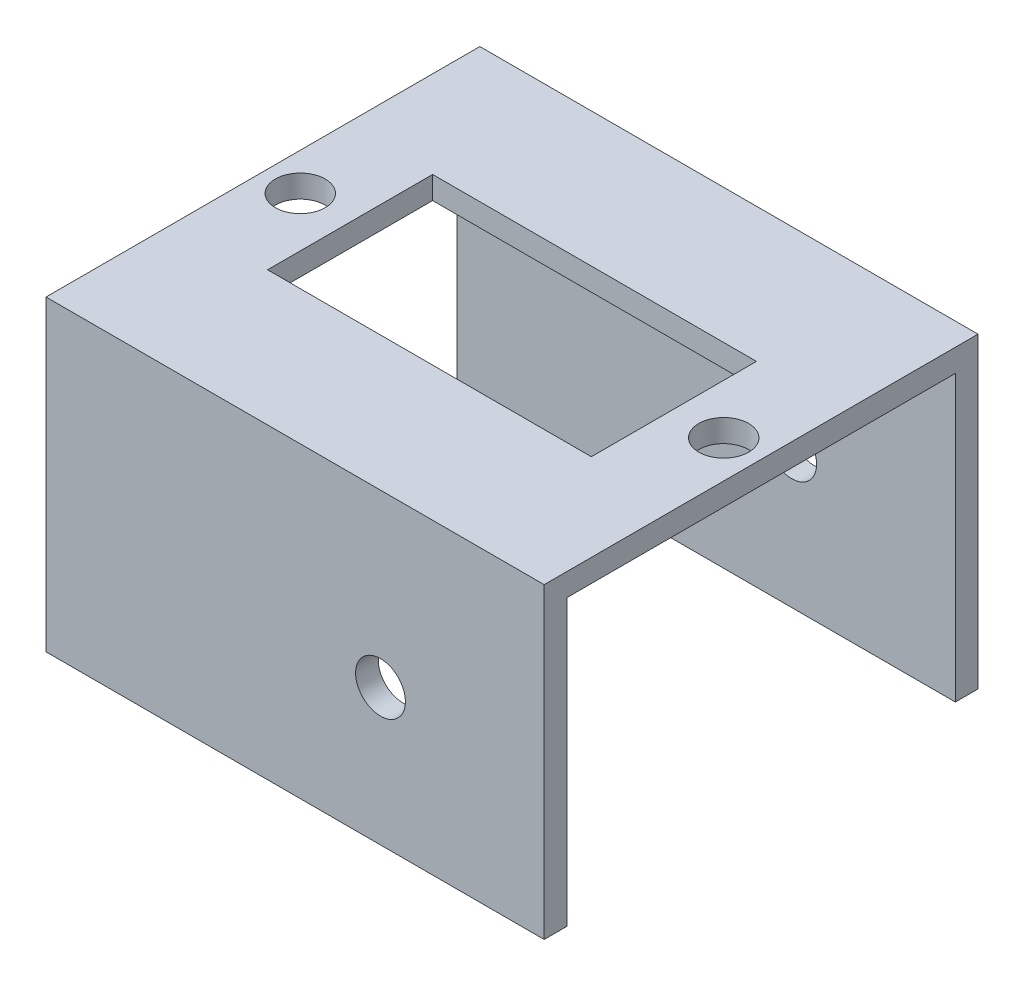
ISO-10303-21;
HEADER;
FILE_DESCRIPTION(('STEP AP214'),'2;1');
FILE_NAME('part.step','',(''),(''),'','','');
FILE_SCHEMA(('AUTOMOTIVE_DESIGN { 1 0 10303 214 1 1 1 1 }'));
ENDSEC;
DATA;
#1=APPLICATION_CONTEXT('core data for automotive mechanical design processes');
#2=APPLICATION_PROTOCOL_DEFINITION('international standard','automotive_design',2000,#1);
#3=PRODUCT_CONTEXT('',#1,'mechanical');
#4=PRODUCT('Part','Part','',(#3));
#5=PRODUCT_RELATED_PRODUCT_CATEGORY('part','',(#4));
#6=PRODUCT_DEFINITION_FORMATION('','',#4);
#7=PRODUCT_DEFINITION_CONTEXT('part definition',#1,'design');
#8=PRODUCT_DEFINITION('design','',#6,#7);
#9=PRODUCT_DEFINITION_SHAPE('','',#8);
#10=(LENGTH_UNIT() NAMED_UNIT(*) SI_UNIT(.MILLI.,.METRE.));
#11=(NAMED_UNIT(*) PLANE_ANGLE_UNIT() SI_UNIT($,.RADIAN.));
#12=(NAMED_UNIT(*) SI_UNIT($,.STERADIAN.) SOLID_ANGLE_UNIT());
#13=UNCERTAINTY_MEASURE_WITH_UNIT(LENGTH_MEASURE(1.E-05),#10,'distance_accuracy_value','');
#14=(GEOMETRIC_REPRESENTATION_CONTEXT(3) GLOBAL_UNCERTAINTY_ASSIGNED_CONTEXT((#13)) GLOBAL_UNIT_ASSIGNED_CONTEXT((#10,
#11,#12)) REPRESENTATION_CONTEXT('',''));
#15=CARTESIAN_POINT('',(0.,0.,0.));
#16=DIRECTION('',(0.,0.,1.));
#17=DIRECTION('',(1.,0.,0.));
#18=AXIS2_PLACEMENT_3D('',#15,#16,#17);
#19=CARTESIAN_POINT('',(0.,0.,0.));
#20=DIRECTION('',(0.,1.,0.));
#21=DIRECTION('',(0.,0.,1.));
#22=AXIS2_PLACEMENT_3D('',#19,#20,#21);
#23=PLANE('',#22);
#24=DIRECTION('',(0.,0.,-1.));
#25=VECTOR('',#24,1.);
#26=CARTESIAN_POINT('',(11.375,0.,-5.8));
#27=LINE('',#26,#25);
#28=CARTESIAN_POINT('',(11.375,0.,5.8));
#29=VERTEX_POINT('',#28);
#30=CARTESIAN_POINT('',(11.375,0.,-5.8));
#31=VERTEX_POINT('',#30);
#32=EDGE_CURVE('E187',#29,#31,#27,.T.);
#33=ORIENTED_EDGE('',*,*,#32,.T.);
#34=DIRECTION('',(-1.,0.,0.));
#35=VECTOR('',#34,1.);
#36=CARTESIAN_POINT('',(-11.375,0.,-5.8));
#37=LINE('',#36,#35);
#38=CARTESIAN_POINT('',(-11.375,0.,-5.8));
#39=VERTEX_POINT('',#38);
#40=EDGE_CURVE('E203',#31,#39,#37,.T.);
#41=ORIENTED_EDGE('',*,*,#40,.T.);
#42=DIRECTION('',(0.,0.,1.));
#43=VECTOR('',#42,1.);
#44=CARTESIAN_POINT('',(-11.375,0.,-5.8));
#45=LINE('',#44,#43);
#46=CARTESIAN_POINT('',(-11.375,0.,5.8));
#47=VERTEX_POINT('',#46);
#48=EDGE_CURVE('E206',#39,#47,#45,.T.);
#49=ORIENTED_EDGE('',*,*,#48,.T.);
#50=DIRECTION('',(1.,0.,0.));
#51=VECTOR('',#50,1.);
#52=CARTESIAN_POINT('',(-11.375,0.,5.8));
#53=LINE('',#52,#51);
#54=EDGE_CURVE('E193',#47,#29,#53,.T.);
#55=ORIENTED_EDGE('',*,*,#54,.T.);
#56=EDGE_LOOP('',(#33,#41,#49,#55));
#57=FACE_BOUND('',#56,.T.);
#58=CARTESIAN_POINT('',(-14.875,0.,0.));
#59=DIRECTION('',(0.,1.,0.));
#60=DIRECTION('',(0.,0.,1.));
#61=AXIS2_PLACEMENT_3D('',#58,#59,#60);
#62=CIRCLE('',#61,1.75);
#63=CARTESIAN_POINT('',(-14.875,0.,-1.75));
#64=VERTEX_POINT('',#63);
#65=EDGE_CURVE('E181',#64,#64,#62,.T.);
#66=ORIENTED_EDGE('',*,*,#65,.T.);
#67=EDGE_LOOP('',(#66));
#68=FACE_BOUND('',#67,.T.);
#69=CARTESIAN_POINT('',(14.875,0.,0.));
#70=DIRECTION('',(0.,1.,0.));
#71=DIRECTION('',(0.,0.,1.));
#72=AXIS2_PLACEMENT_3D('',#69,#70,#71);
#73=CIRCLE('',#72,1.75);
#74=CARTESIAN_POINT('',(14.875,0.,-1.75));
#75=VERTEX_POINT('',#74);
#76=EDGE_CURVE('E175',#75,#75,#73,.T.);
#77=ORIENTED_EDGE('',*,*,#76,.T.);
#78=EDGE_LOOP('',(#77));
#79=FACE_BOUND('',#78,.T.);
#80=DIRECTION('',(-1.,0.,0.));
#81=VECTOR('',#80,1.);
#82=CARTESIAN_POINT('',(-22.5,0.,-13.65));
#83=LINE('',#82,#81);
#84=CARTESIAN_POINT('',(17.5,0.,-13.65));
#85=VERTEX_POINT('',#84);
#86=CARTESIAN_POINT('',(-17.5,0.,-13.65));
#87=VERTEX_POINT('',#86);
#88=EDGE_CURVE('E161',#85,#87,#83,.T.);
#89=ORIENTED_EDGE('',*,*,#88,.F.);
#90=DIRECTION('',(0.,0.,1.));
#91=VECTOR('',#90,1.);
#92=CARTESIAN_POINT('',(17.5,0.,0.));
#93=LINE('',#92,#91);
#94=CARTESIAN_POINT('',(17.5,0.,13.65));
#95=VERTEX_POINT('',#94);
#96=EDGE_CURVE('E254',#85,#95,#93,.T.);
#97=ORIENTED_EDGE('',*,*,#96,.T.);
#98=DIRECTION('',(1.,0.,0.));
#99=VECTOR('',#98,1.);
#100=CARTESIAN_POINT('',(-22.5,0.,13.65));
#101=LINE('',#100,#99);
#102=CARTESIAN_POINT('',(-17.5,0.,13.65));
#103=VERTEX_POINT('',#102);
#104=EDGE_CURVE('E163',#103,#95,#101,.T.);
#105=ORIENTED_EDGE('',*,*,#104,.F.);
#106=DIRECTION('',(0.,0.,-1.));
#107=VECTOR('',#106,1.);
#108=CARTESIAN_POINT('',(-17.5,0.,0.));
#109=LINE('',#108,#107);
#110=EDGE_CURVE('E255',#103,#87,#109,.T.);
#111=ORIENTED_EDGE('',*,*,#110,.T.);
#112=EDGE_LOOP('',(#89,#97,#105,#111));
#113=FACE_BOUND('',#112,.T.);
#114=ADVANCED_FACE('F34',(#57,#68,#79,#113),#23,.F.);
#115=CARTESIAN_POINT('',(0.,1.59,0.));
#116=DIRECTION('',(0.,1.,0.));
#117=DIRECTION('',(0.,0.,1.));
#118=AXIS2_PLACEMENT_3D('',#115,#116,#117);
#119=PLANE('',#118);
#120=DIRECTION('',(0.,0.,1.));
#121=VECTOR('',#120,1.);
#122=CARTESIAN_POINT('',(17.5,1.59,-15.24));
#123=LINE('',#122,#121);
#124=CARTESIAN_POINT('',(17.5,1.59,-15.24));
#125=VERTEX_POINT('',#124);
#126=CARTESIAN_POINT('',(17.5,1.59,15.24));
#127=VERTEX_POINT('',#126);
#128=EDGE_CURVE('E125',#125,#127,#123,.T.);
#129=ORIENTED_EDGE('',*,*,#128,.F.);
#130=DIRECTION('',(-1.,0.,0.));
#131=VECTOR('',#130,1.);
#132=CARTESIAN_POINT('',(-22.5,1.59,-15.24));
#133=LINE('',#132,#131);
#134=CARTESIAN_POINT('',(-17.5,1.59,-15.24));
#135=VERTEX_POINT('',#134);
#136=EDGE_CURVE('E138',#125,#135,#133,.T.);
#137=ORIENTED_EDGE('',*,*,#136,.T.);
#138=DIRECTION('',(0.,0.,-1.));
#139=VECTOR('',#138,1.);
#140=CARTESIAN_POINT('',(-17.5,1.59,-15.24));
#141=LINE('',#140,#139);
#142=CARTESIAN_POINT('',(-17.5,1.59,15.24));
#143=VERTEX_POINT('',#142);
#144=EDGE_CURVE('E332',#143,#135,#141,.T.);
#145=ORIENTED_EDGE('',*,*,#144,.F.);
#146=DIRECTION('',(1.,0.,0.));
#147=VECTOR('',#146,1.);
#148=CARTESIAN_POINT('',(-22.5,1.59,15.24));
#149=LINE('',#148,#147);
#150=EDGE_CURVE('E140',#143,#127,#149,.T.);
#151=ORIENTED_EDGE('',*,*,#150,.T.);
#152=EDGE_LOOP('',(#129,#137,#145,#151));
#153=FACE_BOUND('',#152,.T.);
#154=CARTESIAN_POINT('',(-14.875,1.59,0.));
#155=DIRECTION('',(0.,1.,0.));
#156=DIRECTION('',(0.,0.,1.));
#157=AXIS2_PLACEMENT_3D('',#154,#155,#156);
#158=CIRCLE('',#157,1.75);
#159=CARTESIAN_POINT('',(-14.875,1.59,-1.75));
#160=VERTEX_POINT('',#159);
#161=EDGE_CURVE('E184',#160,#160,#158,.T.);
#162=ORIENTED_EDGE('',*,*,#161,.F.);
#163=EDGE_LOOP('',(#162));
#164=FACE_BOUND('',#163,.T.);
#165=DIRECTION('',(-1.,0.,0.));
#166=VECTOR('',#165,1.);
#167=CARTESIAN_POINT('',(-11.375,1.59,-5.8));
#168=LINE('',#167,#166);
#169=CARTESIAN_POINT('',(11.375,1.59,-5.8));
#170=VERTEX_POINT('',#169);
#171=CARTESIAN_POINT('',(-11.375,1.59,-5.8));
#172=VERTEX_POINT('',#171);
#173=EDGE_CURVE('E192',#170,#172,#168,.T.);
#174=ORIENTED_EDGE('',*,*,#173,.F.);
#175=DIRECTION('',(0.,0.,-1.));
#176=VECTOR('',#175,1.);
#177=CARTESIAN_POINT('',(11.375,1.59,-5.8));
#178=LINE('',#177,#176);
#179=CARTESIAN_POINT('',(11.375,1.59,5.8));
#180=VERTEX_POINT('',#179);
#181=EDGE_CURVE('E190',#180,#170,#178,.T.);
#182=ORIENTED_EDGE('',*,*,#181,.F.);
#183=DIRECTION('',(1.,0.,0.));
#184=VECTOR('',#183,1.);
#185=CARTESIAN_POINT('',(-11.375,1.59,5.8));
#186=LINE('',#185,#184);
#187=CARTESIAN_POINT('',(-11.375,1.59,5.8));
#188=VERTEX_POINT('',#187);
#189=EDGE_CURVE('E198',#188,#180,#186,.T.);
#190=ORIENTED_EDGE('',*,*,#189,.F.);
#191=DIRECTION('',(0.,0.,1.));
#192=VECTOR('',#191,1.);
#193=CARTESIAN_POINT('',(-11.375,1.59,-5.8));
#194=LINE('',#193,#192);
#195=EDGE_CURVE('E195',#172,#188,#194,.T.);
#196=ORIENTED_EDGE('',*,*,#195,.F.);
#197=EDGE_LOOP('',(#174,#182,#190,#196));
#198=FACE_BOUND('',#197,.T.);
#199=CARTESIAN_POINT('',(14.875,1.59,0.));
#200=DIRECTION('',(0.,1.,0.));
#201=DIRECTION('',(0.,0.,1.));
#202=AXIS2_PLACEMENT_3D('',#199,#200,#201);
#203=CIRCLE('',#202,1.75);
#204=CARTESIAN_POINT('',(14.875,1.59,-1.75));
#205=VERTEX_POINT('',#204);
#206=EDGE_CURVE('E178',#205,#205,#203,.T.);
#207=ORIENTED_EDGE('',*,*,#206,.F.);
#208=EDGE_LOOP('',(#207));
#209=FACE_BOUND('',#208,.T.);
#210=ADVANCED_FACE('F135',(#153,#164,#198,#209),#119,.T.);
#211=CARTESIAN_POINT('',(-22.5,1.59,-15.24));
#212=DIRECTION('',(0.,0.,1.));
#213=DIRECTION('',(1.,0.,0.));
#214=AXIS2_PLACEMENT_3D('',#211,#212,#213);
#215=PLANE('',#214);
#216=CARTESIAN_POINT('',(6.00000000000001,-10.41,-15.24));
#217=DIRECTION('',(0.,0.,1.));
#218=DIRECTION('',(1.,0.,0.));
#219=AXIS2_PLACEMENT_3D('',#216,#217,#218);
#220=CIRCLE('',#219,1.75);
#221=CARTESIAN_POINT('',(7.75000000000001,-10.41,-15.24));
#222=VERTEX_POINT('',#221);
#223=EDGE_CURVE('E165',#222,#222,#220,.T.);
#224=ORIENTED_EDGE('',*,*,#223,.T.);
#225=EDGE_LOOP('',(#224));
#226=FACE_BOUND('',#225,.T.);
#227=ORIENTED_EDGE('',*,*,#136,.F.);
#228=DIRECTION('',(0.,1.,0.));
#229=VECTOR('',#228,1.);
#230=CARTESIAN_POINT('',(17.5,-28.41,-15.24));
#231=LINE('',#230,#229);
#232=CARTESIAN_POINT('',(17.5,-20.,-15.24));
#233=VERTEX_POINT('',#232);
#234=EDGE_CURVE('E122',#233,#125,#231,.T.);
#235=ORIENTED_EDGE('',*,*,#234,.F.);
#236=DIRECTION('',(1.,0.,0.));
#237=VECTOR('',#236,1.);
#238=CARTESIAN_POINT('',(-22.5,-20.,-15.24));
#239=LINE('',#238,#237);
#240=CARTESIAN_POINT('',(-17.5,-20.,-15.24));
#241=VERTEX_POINT('',#240);
#242=EDGE_CURVE('E156',#241,#233,#239,.T.);
#243=ORIENTED_EDGE('',*,*,#242,.F.);
#244=DIRECTION('',(0.,1.,0.));
#245=VECTOR('',#244,1.);
#246=CARTESIAN_POINT('',(-17.5,-28.41,-15.24));
#247=LINE('',#246,#245);
#248=EDGE_CURVE('E56',#241,#135,#247,.T.);
#249=ORIENTED_EDGE('',*,*,#248,.T.);
#250=EDGE_LOOP('',(#227,#235,#243,#249));
#251=FACE_BOUND('',#250,.T.);
#252=ADVANCED_FACE('F36',(#226,#251),#215,.F.);
#253=CARTESIAN_POINT('',(-22.5,1.59,15.24));
#254=DIRECTION('',(0.,0.,-1.));
#255=DIRECTION('',(-1.,0.,0.));
#256=AXIS2_PLACEMENT_3D('',#253,#254,#255);
#257=PLANE('',#256);
#258=CARTESIAN_POINT('',(6.00000000000001,-10.41,15.24));
#259=DIRECTION('',(0.,0.,1.));
#260=DIRECTION('',(1.,0.,0.));
#261=AXIS2_PLACEMENT_3D('',#258,#259,#260);
#262=CIRCLE('',#261,1.75);
#263=CARTESIAN_POINT('',(7.75000000000001,-10.41,15.24));
#264=VERTEX_POINT('',#263);
#265=EDGE_CURVE('E153',#264,#264,#262,.T.);
#266=ORIENTED_EDGE('',*,*,#265,.F.);
#267=EDGE_LOOP('',(#266));
#268=FACE_BOUND('',#267,.T.);
#269=DIRECTION('',(-1.,0.,0.));
#270=VECTOR('',#269,1.);
#271=CARTESIAN_POINT('',(-22.5,-20.,15.24));
#272=LINE('',#271,#270);
#273=CARTESIAN_POINT('',(17.5,-20.,15.24));
#274=VERTEX_POINT('',#273);
#275=CARTESIAN_POINT('',(-17.5,-20.,15.24));
#276=VERTEX_POINT('',#275);
#277=EDGE_CURVE('E173',#274,#276,#272,.T.);
#278=ORIENTED_EDGE('',*,*,#277,.F.);
#279=DIRECTION('',(0.,1.,0.));
#280=VECTOR('',#279,1.);
#281=CARTESIAN_POINT('',(17.5,-28.41,15.24));
#282=LINE('',#281,#280);
#283=EDGE_CURVE('E131',#274,#127,#282,.T.);
#284=ORIENTED_EDGE('',*,*,#283,.T.);
#285=ORIENTED_EDGE('',*,*,#150,.F.);
#286=DIRECTION('',(0.,1.,0.));
#287=VECTOR('',#286,1.);
#288=CARTESIAN_POINT('',(-17.5,-28.41,15.24));
#289=LINE('',#288,#287);
#290=EDGE_CURVE('E265',#276,#143,#289,.T.);
#291=ORIENTED_EDGE('',*,*,#290,.F.);
#292=EDGE_LOOP('',(#278,#284,#285,#291));
#293=FACE_BOUND('',#292,.T.);
#294=ADVANCED_FACE('F314',(#268,#293),#257,.F.);
#295=CARTESIAN_POINT('',(11.375,1.59,-5.8));
#296=DIRECTION('',(-1.,0.,0.));
#297=DIRECTION('',(0.,0.,1.));
#298=AXIS2_PLACEMENT_3D('',#295,#296,#297);
#299=PLANE('',#298);
#300=ORIENTED_EDGE('',*,*,#32,.F.);
#301=DIRECTION('',(0.,-1.,0.));
#302=VECTOR('',#301,1.);
#303=CARTESIAN_POINT('',(11.375,1.59,5.8));
#304=LINE('',#303,#302);
#305=EDGE_CURVE('E200',#180,#29,#304,.T.);
#306=ORIENTED_EDGE('',*,*,#305,.F.);
#307=ORIENTED_EDGE('',*,*,#181,.T.);
#308=DIRECTION('',(0.,-1.,0.));
#309=VECTOR('',#308,1.);
#310=CARTESIAN_POINT('',(11.375,1.59,-5.8));
#311=LINE('',#310,#309);
#312=EDGE_CURVE('E142',#170,#31,#311,.T.);
#313=ORIENTED_EDGE('',*,*,#312,.T.);
#314=EDGE_LOOP('',(#300,#306,#307,#313));
#315=FACE_BOUND('',#314,.T.);
#316=ADVANCED_FACE('F228',(#315),#299,.T.);
#317=CARTESIAN_POINT('',(-11.375,1.59,-5.8));
#318=DIRECTION('',(0.,0.,1.));
#319=DIRECTION('',(1.,0.,0.));
#320=AXIS2_PLACEMENT_3D('',#317,#318,#319);
#321=PLANE('',#320);
#322=ORIENTED_EDGE('',*,*,#40,.F.);
#323=ORIENTED_EDGE('',*,*,#312,.F.);
#324=ORIENTED_EDGE('',*,*,#173,.T.);
#325=DIRECTION('',(0.,-1.,0.));
#326=VECTOR('',#325,1.);
#327=CARTESIAN_POINT('',(-11.375,1.59,-5.8));
#328=LINE('',#327,#326);
#329=EDGE_CURVE('E146',#172,#39,#328,.T.);
#330=ORIENTED_EDGE('',*,*,#329,.T.);
#331=EDGE_LOOP('',(#322,#323,#324,#330));
#332=FACE_BOUND('',#331,.T.);
#333=ADVANCED_FACE('F217',(#332),#321,.T.);
#334=CARTESIAN_POINT('',(-11.375,1.59,-5.8));
#335=DIRECTION('',(1.,0.,0.));
#336=DIRECTION('',(0.,0.,-1.));
#337=AXIS2_PLACEMENT_3D('',#334,#335,#336);
#338=PLANE('',#337);
#339=ORIENTED_EDGE('',*,*,#48,.F.);
#340=ORIENTED_EDGE('',*,*,#329,.F.);
#341=ORIENTED_EDGE('',*,*,#195,.T.);
#342=DIRECTION('',(0.,-1.,0.));
#343=VECTOR('',#342,1.);
#344=CARTESIAN_POINT('',(-11.375,1.59,5.8));
#345=LINE('',#344,#343);
#346=EDGE_CURVE('E213',#188,#47,#345,.T.);
#347=ORIENTED_EDGE('',*,*,#346,.T.);
#348=EDGE_LOOP('',(#339,#340,#341,#347));
#349=FACE_BOUND('',#348,.T.);
#350=ADVANCED_FACE('F222',(#349),#338,.T.);
#351=CARTESIAN_POINT('',(-11.375,1.59,5.8));
#352=DIRECTION('',(0.,0.,-1.));
#353=DIRECTION('',(-1.,0.,0.));
#354=AXIS2_PLACEMENT_3D('',#351,#352,#353);
#355=PLANE('',#354);
#356=ORIENTED_EDGE('',*,*,#54,.F.);
#357=ORIENTED_EDGE('',*,*,#346,.F.);
#358=ORIENTED_EDGE('',*,*,#189,.T.);
#359=ORIENTED_EDGE('',*,*,#305,.T.);
#360=EDGE_LOOP('',(#356,#357,#358,#359));
#361=FACE_BOUND('',#360,.T.);
#362=ADVANCED_FACE('F231',(#361),#355,.T.);
#363=CARTESIAN_POINT('',(-14.875,1.59,0.));
#364=DIRECTION('',(0.,-1.,0.));
#365=DIRECTION('',(0.,0.,-1.));
#366=AXIS2_PLACEMENT_3D('',#363,#364,#365);
#367=CYLINDRICAL_SURFACE('',#366,1.75);
#368=CARTESIAN_POINT('',(-14.875,1.59,-1.75));
#369=CARTESIAN_POINT('',(-14.875,1.5734375,-1.75));
#370=CARTESIAN_POINT('',(-14.875,1.556875,-1.75));
#371=CARTESIAN_POINT('',(-14.875,1.52375,-1.75));
#372=CARTESIAN_POINT('',(-14.875,1.5071875,-1.75));
#373=CARTESIAN_POINT('',(-14.875,1.4740625,-1.75));
#374=CARTESIAN_POINT('',(-14.875,1.4575,-1.75));
#375=CARTESIAN_POINT('',(-14.875,1.424375,-1.75));
#376=CARTESIAN_POINT('',(-14.875,1.4078125,-1.75));
#377=CARTESIAN_POINT('',(-14.875,1.3746875,-1.75));
#378=CARTESIAN_POINT('',(-14.875,1.358125,-1.75));
#379=CARTESIAN_POINT('',(-14.875,1.325,-1.75));
#380=CARTESIAN_POINT('',(-14.875,1.3084375,-1.75));
#381=CARTESIAN_POINT('',(-14.875,1.2753125,-1.75));
#382=CARTESIAN_POINT('',(-14.875,1.25875,-1.75));
#383=CARTESIAN_POINT('',(-14.875,1.225625,-1.75));
#384=CARTESIAN_POINT('',(-14.875,1.2090625,-1.75));
#385=CARTESIAN_POINT('',(-14.875,1.1759375,-1.75));
#386=CARTESIAN_POINT('',(-14.875,1.159375,-1.75));
#387=CARTESIAN_POINT('',(-14.875,1.12625,-1.75));
#388=CARTESIAN_POINT('',(-14.875,1.1096875,-1.75));
#389=CARTESIAN_POINT('',(-14.875,1.0765625,-1.75));
#390=CARTESIAN_POINT('',(-14.875,1.06,-1.75));
#391=CARTESIAN_POINT('',(-14.875,1.026875,-1.75));
#392=CARTESIAN_POINT('',(-14.875,1.0103125,-1.75));
#393=CARTESIAN_POINT('',(-14.875,0.9771875,-1.75));
#394=CARTESIAN_POINT('',(-14.875,0.960625,-1.75));
#395=CARTESIAN_POINT('',(-14.875,0.9275,-1.75));
#396=CARTESIAN_POINT('',(-14.875,0.9109375,-1.75));
#397=CARTESIAN_POINT('',(-14.875,0.8778125,-1.75));
#398=CARTESIAN_POINT('',(-14.875,0.86125,-1.75));
#399=CARTESIAN_POINT('',(-14.875,0.828125,-1.75));
#400=CARTESIAN_POINT('',(-14.875,0.8115625,-1.75));
#401=CARTESIAN_POINT('',(-14.875,0.7784375,-1.75));
#402=CARTESIAN_POINT('',(-14.875,0.761875,-1.75));
#403=CARTESIAN_POINT('',(-14.875,0.72875,-1.75));
#404=CARTESIAN_POINT('',(-14.875,0.7121875,-1.75));
#405=CARTESIAN_POINT('',(-14.875,0.6790625,-1.75));
#406=CARTESIAN_POINT('',(-14.875,0.6625,-1.75));
#407=CARTESIAN_POINT('',(-14.875,0.629375,-1.75));
#408=CARTESIAN_POINT('',(-14.875,0.6128125,-1.75));
#409=CARTESIAN_POINT('',(-14.875,0.5796875,-1.75));
#410=CARTESIAN_POINT('',(-14.875,0.563125,-1.75));
#411=CARTESIAN_POINT('',(-14.875,0.53,-1.75));
#412=CARTESIAN_POINT('',(-14.875,0.5134375,-1.75));
#413=CARTESIAN_POINT('',(-14.875,0.4803125,-1.75));
#414=CARTESIAN_POINT('',(-14.875,0.46375,-1.75));
#415=CARTESIAN_POINT('',(-14.875,0.430625,-1.75));
#416=CARTESIAN_POINT('',(-14.875,0.4140625,-1.75));
#417=CARTESIAN_POINT('',(-14.875,0.3809375,-1.75));
#418=CARTESIAN_POINT('',(-14.875,0.364375,-1.75));
#419=CARTESIAN_POINT('',(-14.875,0.33125,-1.75));
#420=CARTESIAN_POINT('',(-14.875,0.3146875,-1.75));
#421=CARTESIAN_POINT('',(-14.875,0.2815625,-1.75));
#422=CARTESIAN_POINT('',(-14.875,0.265,-1.75));
#423=CARTESIAN_POINT('',(-14.875,0.231875,-1.75));
#424=CARTESIAN_POINT('',(-14.875,0.2153125,-1.75));
#425=CARTESIAN_POINT('',(-14.875,0.1821875,-1.75));
#426=CARTESIAN_POINT('',(-14.875,0.165625,-1.75));
#427=CARTESIAN_POINT('',(-14.875,0.1325,-1.75));
#428=CARTESIAN_POINT('',(-14.875,0.1159375,-1.75));
#429=CARTESIAN_POINT('',(-14.875,0.0828125000000001,-1.75));
#430=CARTESIAN_POINT('',(-14.875,0.06625,-1.75));
#431=CARTESIAN_POINT('',(-14.875,0.033125,-1.75));
#432=CARTESIAN_POINT('',(-14.875,0.0165625,-1.75));
#433=CARTESIAN_POINT('',(-14.875,0.,-1.75));
#434=B_SPLINE_CURVE_WITH_KNOTS('',3,(#368,#369,#370,#371,#372,#373,#374,#375,#376,#377,#378,
#379,#380,#381,#382,#383,#384,#385,#386,#387,#388,#389,#390,#391,#392,#393,#394,#395,#396,#397,
#398,#399,#400,#401,#402,#403,#404,#405,#406,#407,#408,#409,#410,#411,#412,#413,#414,#415,#416,
#417,#418,#419,#420,#421,#422,#423,#424,#425,#426,#427,#428,#429,#430,#431,#432,#433),
.UNSPECIFIED.,.F.,.F.,(4,2,2,2,2,2,2,2,2,2,2,2,2,2,2,2,2,2,2,2,2,2,2,2,2,2,2,2,2,2,2,2,4),(0.,
0.0496875,0.0993750000000001,0.1490625,0.19875,0.2484375,0.298125,0.3478125,0.3975,0.4471875,
0.496875,0.5465625,0.59625,0.6459375,0.695625,0.7453125,0.795,0.8446875,0.894375,0.9440625,
0.99375,1.0434375,1.093125,1.1428125,1.1925,1.2421875,1.291875,1.3415625,1.39125,1.4409375,
1.490625,1.5403125,1.59),.UNSPECIFIED.);
#435=EDGE_CURVE('BSEAM243',#160,#64,#434,.T.);
#436=ORIENTED_EDGE('',*,*,#161,.T.);
#437=ORIENTED_EDGE('',*,*,#65,.F.);
#438=ORIENTED_EDGE('',*,*,#435,.T.);
#439=ORIENTED_EDGE('',*,*,#435,.F.);
#440=EDGE_LOOP('',(#436,#438,#437,#439));
#441=FACE_BOUND('',#440,.T.);
#442=ADVANCED_FACE('F243',(#441),#367,.F.);
#443=CARTESIAN_POINT('',(14.875,1.59,0.));
#444=DIRECTION('',(0.,-1.,0.));
#445=DIRECTION('',(0.,0.,-1.));
#446=AXIS2_PLACEMENT_3D('',#443,#444,#445);
#447=CYLINDRICAL_SURFACE('',#446,1.75);
#448=CARTESIAN_POINT('',(14.875,1.59,-1.75));
#449=CARTESIAN_POINT('',(14.875,1.5734375,-1.75));
#450=CARTESIAN_POINT('',(14.875,1.556875,-1.75));
#451=CARTESIAN_POINT('',(14.875,1.52375,-1.75));
#452=CARTESIAN_POINT('',(14.875,1.5071875,-1.75));
#453=CARTESIAN_POINT('',(14.875,1.4740625,-1.75));
#454=CARTESIAN_POINT('',(14.875,1.4575,-1.75));
#455=CARTESIAN_POINT('',(14.875,1.424375,-1.75));
#456=CARTESIAN_POINT('',(14.875,1.4078125,-1.75));
#457=CARTESIAN_POINT('',(14.875,1.3746875,-1.75));
#458=CARTESIAN_POINT('',(14.875,1.358125,-1.75));
#459=CARTESIAN_POINT('',(14.875,1.325,-1.75));
#460=CARTESIAN_POINT('',(14.875,1.3084375,-1.75));
#461=CARTESIAN_POINT('',(14.875,1.2753125,-1.75));
#462=CARTESIAN_POINT('',(14.875,1.25875,-1.75));
#463=CARTESIAN_POINT('',(14.875,1.225625,-1.75));
#464=CARTESIAN_POINT('',(14.875,1.2090625,-1.75));
#465=CARTESIAN_POINT('',(14.875,1.1759375,-1.75));
#466=CARTESIAN_POINT('',(14.875,1.159375,-1.75));
#467=CARTESIAN_POINT('',(14.875,1.12625,-1.75));
#468=CARTESIAN_POINT('',(14.875,1.1096875,-1.75));
#469=CARTESIAN_POINT('',(14.875,1.0765625,-1.75));
#470=CARTESIAN_POINT('',(14.875,1.06,-1.75));
#471=CARTESIAN_POINT('',(14.875,1.026875,-1.75));
#472=CARTESIAN_POINT('',(14.875,1.0103125,-1.75));
#473=CARTESIAN_POINT('',(14.875,0.9771875,-1.75));
#474=CARTESIAN_POINT('',(14.875,0.960625,-1.75));
#475=CARTESIAN_POINT('',(14.875,0.9275,-1.75));
#476=CARTESIAN_POINT('',(14.875,0.9109375,-1.75));
#477=CARTESIAN_POINT('',(14.875,0.8778125,-1.75));
#478=CARTESIAN_POINT('',(14.875,0.86125,-1.75));
#479=CARTESIAN_POINT('',(14.875,0.828125,-1.75));
#480=CARTESIAN_POINT('',(14.875,0.8115625,-1.75));
#481=CARTESIAN_POINT('',(14.875,0.7784375,-1.75));
#482=CARTESIAN_POINT('',(14.875,0.761875,-1.75));
#483=CARTESIAN_POINT('',(14.875,0.72875,-1.75));
#484=CARTESIAN_POINT('',(14.875,0.7121875,-1.75));
#485=CARTESIAN_POINT('',(14.875,0.6790625,-1.75));
#486=CARTESIAN_POINT('',(14.875,0.6625,-1.75));
#487=CARTESIAN_POINT('',(14.875,0.629375,-1.75));
#488=CARTESIAN_POINT('',(14.875,0.6128125,-1.75));
#489=CARTESIAN_POINT('',(14.875,0.5796875,-1.75));
#490=CARTESIAN_POINT('',(14.875,0.563125,-1.75));
#491=CARTESIAN_POINT('',(14.875,0.53,-1.75));
#492=CARTESIAN_POINT('',(14.875,0.5134375,-1.75));
#493=CARTESIAN_POINT('',(14.875,0.4803125,-1.75));
#494=CARTESIAN_POINT('',(14.875,0.46375,-1.75));
#495=CARTESIAN_POINT('',(14.875,0.430625,-1.75));
#496=CARTESIAN_POINT('',(14.875,0.4140625,-1.75));
#497=CARTESIAN_POINT('',(14.875,0.3809375,-1.75));
#498=CARTESIAN_POINT('',(14.875,0.364375,-1.75));
#499=CARTESIAN_POINT('',(14.875,0.33125,-1.75));
#500=CARTESIAN_POINT('',(14.875,0.3146875,-1.75));
#501=CARTESIAN_POINT('',(14.875,0.2815625,-1.75));
#502=CARTESIAN_POINT('',(14.875,0.265,-1.75));
#503=CARTESIAN_POINT('',(14.875,0.231875,-1.75));
#504=CARTESIAN_POINT('',(14.875,0.2153125,-1.75));
#505=CARTESIAN_POINT('',(14.875,0.1821875,-1.75));
#506=CARTESIAN_POINT('',(14.875,0.165625,-1.75));
#507=CARTESIAN_POINT('',(14.875,0.1325,-1.75));
#508=CARTESIAN_POINT('',(14.875,0.1159375,-1.75));
#509=CARTESIAN_POINT('',(14.875,0.0828125000000001,-1.75));
#510=CARTESIAN_POINT('',(14.875,0.06625,-1.75));
#511=CARTESIAN_POINT('',(14.875,0.033125,-1.75));
#512=CARTESIAN_POINT('',(14.875,0.0165625,-1.75));
#513=CARTESIAN_POINT('',(14.875,0.,-1.75));
#514=B_SPLINE_CURVE_WITH_KNOTS('',3,(#448,#449,#450,#451,#452,#453,#454,#455,#456,#457,#458,
#459,#460,#461,#462,#463,#464,#465,#466,#467,#468,#469,#470,#471,#472,#473,#474,#475,#476,#477,
#478,#479,#480,#481,#482,#483,#484,#485,#486,#487,#488,#489,#490,#491,#492,#493,#494,#495,#496,
#497,#498,#499,#500,#501,#502,#503,#504,#505,#506,#507,#508,#509,#510,#511,#512,#513),
.UNSPECIFIED.,.F.,.F.,(4,2,2,2,2,2,2,2,2,2,2,2,2,2,2,2,2,2,2,2,2,2,2,2,2,2,2,2,2,2,2,2,4),(0.,
0.0496875,0.0993750000000001,0.1490625,0.19875,0.2484375,0.298125,0.3478125,0.3975,0.4471875,
0.496875,0.5465625,0.59625,0.6459375,0.695625,0.7453125,0.795,0.8446875,0.894375,0.9440625,
0.99375,1.0434375,1.093125,1.1428125,1.1925,1.2421875,1.291875,1.3415625,1.39125,1.4409375,
1.490625,1.5403125,1.59),.UNSPECIFIED.);
#515=EDGE_CURVE('BSEAM239',#205,#75,#514,.T.);
#516=ORIENTED_EDGE('',*,*,#206,.T.);
#517=ORIENTED_EDGE('',*,*,#76,.F.);
#518=ORIENTED_EDGE('',*,*,#515,.T.);
#519=ORIENTED_EDGE('',*,*,#515,.F.);
#520=EDGE_LOOP('',(#516,#518,#517,#519));
#521=FACE_BOUND('',#520,.T.);
#522=ADVANCED_FACE('F239',(#521),#447,.F.);
#523=CARTESIAN_POINT('',(-22.5,-20.,13.65));
#524=DIRECTION('',(0.,0.,1.));
#525=DIRECTION('',(1.,0.,0.));
#526=AXIS2_PLACEMENT_3D('',#523,#524,#525);
#527=PLANE('',#526);
#528=CARTESIAN_POINT('',(6.00000000000001,-10.41,13.65));
#529=DIRECTION('',(0.,0.,1.));
#530=DIRECTION('',(1.,0.,0.));
#531=AXIS2_PLACEMENT_3D('',#528,#529,#530);
#532=CIRCLE('',#531,1.75);
#533=CARTESIAN_POINT('',(7.75000000000001,-10.41,13.65));
#534=VERTEX_POINT('',#533);
#535=EDGE_CURVE('E152',#534,#534,#532,.T.);
#536=ORIENTED_EDGE('',*,*,#535,.T.);
#537=EDGE_LOOP('',(#536));
#538=FACE_BOUND('',#537,.T.);
#539=ORIENTED_EDGE('',*,*,#104,.T.);
#540=DIRECTION('',(0.,-1.,0.));
#541=VECTOR('',#540,1.);
#542=CARTESIAN_POINT('',(17.5,-20.,13.65));
#543=LINE('',#542,#541);
#544=CARTESIAN_POINT('',(17.5,-20.,13.65));
#545=VERTEX_POINT('',#544);
#546=EDGE_CURVE('E330',#95,#545,#543,.T.);
#547=ORIENTED_EDGE('',*,*,#546,.T.);
#548=DIRECTION('',(1.,0.,0.));
#549=VECTOR('',#548,1.);
#550=CARTESIAN_POINT('',(-22.5,-20.,13.65));
#551=LINE('',#550,#549);
#552=CARTESIAN_POINT('',(-17.5,-20.,13.65));
#553=VERTEX_POINT('',#552);
#554=EDGE_CURVE('E170',#553,#545,#551,.T.);
#555=ORIENTED_EDGE('',*,*,#554,.F.);
#556=DIRECTION('',(0.,1.,0.));
#557=VECTOR('',#556,1.);
#558=CARTESIAN_POINT('',(-17.5,-20.,13.65));
#559=LINE('',#558,#557);
#560=EDGE_CURVE('E263',#553,#103,#559,.T.);
#561=ORIENTED_EDGE('',*,*,#560,.T.);
#562=EDGE_LOOP('',(#539,#547,#555,#561));
#563=FACE_BOUND('',#562,.T.);
#564=ADVANCED_FACE('F242',(#538,#563),#527,.F.);
#565=CARTESIAN_POINT('',(0.,-20.,0.));
#566=DIRECTION('',(0.,-1.,0.));
#567=DIRECTION('',(0.,0.,-1.));
#568=AXIS2_PLACEMENT_3D('',#565,#566,#567);
#569=PLANE('',#568);
#570=DIRECTION('',(0.,0.,-1.));
#571=VECTOR('',#570,1.);
#572=CARTESIAN_POINT('',(17.5,-20.,0.));
#573=LINE('',#572,#571);
#574=EDGE_CURVE('E327',#274,#545,#573,.T.);
#575=ORIENTED_EDGE('',*,*,#574,.F.);
#576=ORIENTED_EDGE('',*,*,#277,.T.);
#577=DIRECTION('',(0.,0.,1.));
#578=VECTOR('',#577,1.);
#579=CARTESIAN_POINT('',(-17.5,-20.,0.));
#580=LINE('',#579,#578);
#581=EDGE_CURVE('E270',#553,#276,#580,.T.);
#582=ORIENTED_EDGE('',*,*,#581,.F.);
#583=ORIENTED_EDGE('',*,*,#554,.T.);
#584=EDGE_LOOP('',(#575,#576,#582,#583));
#585=FACE_BOUND('',#584,.T.);
#586=ADVANCED_FACE('F297',(#585),#569,.T.);
#587=CARTESIAN_POINT('',(-22.5,-20.,-13.65));
#588=DIRECTION('',(0.,0.,-1.));
#589=DIRECTION('',(-1.,0.,0.));
#590=AXIS2_PLACEMENT_3D('',#587,#588,#589);
#591=PLANE('',#590);
#592=CARTESIAN_POINT('',(6.00000000000001,-10.41,-13.65));
#593=DIRECTION('',(0.,0.,-1.));
#594=DIRECTION('',(-1.,0.,0.));
#595=AXIS2_PLACEMENT_3D('',#592,#593,#594);
#596=CIRCLE('',#595,1.75);
#597=CARTESIAN_POINT('',(4.25000000000001,-10.41,-13.65));
#598=VERTEX_POINT('',#597);
#599=EDGE_CURVE('E150',#598,#598,#596,.T.);
#600=ORIENTED_EDGE('',*,*,#599,.T.);
#601=EDGE_LOOP('',(#600));
#602=FACE_BOUND('',#601,.T.);
#603=DIRECTION('',(-1.,0.,0.));
#604=VECTOR('',#603,1.);
#605=CARTESIAN_POINT('',(-22.5,-20.,-13.65));
#606=LINE('',#605,#604);
#607=CARTESIAN_POINT('',(17.5,-20.,-13.65));
#608=VERTEX_POINT('',#607);
#609=CARTESIAN_POINT('',(-17.5,-20.,-13.65));
#610=VERTEX_POINT('',#609);
#611=EDGE_CURVE('E158',#608,#610,#606,.T.);
#612=ORIENTED_EDGE('',*,*,#611,.F.);
#613=DIRECTION('',(0.,1.,0.));
#614=VECTOR('',#613,1.);
#615=CARTESIAN_POINT('',(17.5,-20.,-13.65));
#616=LINE('',#615,#614);
#617=EDGE_CURVE('E49',#608,#85,#616,.T.);
#618=ORIENTED_EDGE('',*,*,#617,.T.);
#619=ORIENTED_EDGE('',*,*,#88,.T.);
#620=DIRECTION('',(0.,-1.,0.));
#621=VECTOR('',#620,1.);
#622=CARTESIAN_POINT('',(-17.5,-20.,-13.65));
#623=LINE('',#622,#621);
#624=EDGE_CURVE('E258',#87,#610,#623,.T.);
#625=ORIENTED_EDGE('',*,*,#624,.T.);
#626=EDGE_LOOP('',(#612,#618,#619,#625));
#627=FACE_BOUND('',#626,.T.);
#628=ADVANCED_FACE('F257',(#602,#627),#591,.F.);
#629=CARTESIAN_POINT('',(0.,-20.,0.));
#630=DIRECTION('',(0.,1.,0.));
#631=DIRECTION('',(0.,0.,1.));
#632=AXIS2_PLACEMENT_3D('',#629,#630,#631);
#633=PLANE('',#632);
#634=ORIENTED_EDGE('',*,*,#242,.T.);
#635=DIRECTION('',(0.,0.,1.));
#636=VECTOR('',#635,1.);
#637=CARTESIAN_POINT('',(17.5,-20.,0.));
#638=LINE('',#637,#636);
#639=EDGE_CURVE('E11',#233,#608,#638,.T.);
#640=ORIENTED_EDGE('',*,*,#639,.T.);
#641=ORIENTED_EDGE('',*,*,#611,.T.);
#642=DIRECTION('',(0.,0.,-1.));
#643=VECTOR('',#642,1.);
#644=CARTESIAN_POINT('',(-17.5,-20.,0.));
#645=LINE('',#644,#643);
#646=EDGE_CURVE('E42',#610,#241,#645,.T.);
#647=ORIENTED_EDGE('',*,*,#646,.T.);
#648=EDGE_LOOP('',(#634,#640,#641,#647));
#649=FACE_BOUND('',#648,.T.);
#650=ADVANCED_FACE('F155',(#649),#633,.F.);
#651=CARTESIAN_POINT('',(6.00000000000001,-10.41,-24.76));
#652=DIRECTION('',(0.,0.,1.));
#653=DIRECTION('',(1.,0.,0.));
#654=AXIS2_PLACEMENT_3D('',#651,#652,#653);
#655=CYLINDRICAL_SURFACE('',#654,1.75);
#656=ORIENTED_EDGE('',*,*,#599,.F.);
#657=EDGE_LOOP('',(#656));
#658=FACE_BOUND('',#657,.T.);
#659=ORIENTED_EDGE('',*,*,#223,.F.);
#660=EDGE_LOOP('',(#659));
#661=FACE_BOUND('',#660,.T.);
#662=ADVANCED_FACE('F280',(#658,#661),#655,.F.);
#663=ORIENTED_EDGE('',*,*,#265,.T.);
#664=EDGE_LOOP('',(#663));
#665=FACE_BOUND('',#664,.T.);
#666=ORIENTED_EDGE('',*,*,#535,.F.);
#667=EDGE_LOOP('',(#666));
#668=FACE_BOUND('',#667,.T.);
#669=ADVANCED_FACE('F282',(#665,#668),#655,.F.);
#670=CARTESIAN_POINT('',(-17.5,-28.41,-15.24));
#671=DIRECTION('',(1.,0.,0.));
#672=DIRECTION('',(0.,0.,-1.));
#673=AXIS2_PLACEMENT_3D('',#670,#671,#672);
#674=PLANE('',#673);
#675=ORIENTED_EDGE('',*,*,#581,.T.);
#676=ORIENTED_EDGE('',*,*,#290,.T.);
#677=ORIENTED_EDGE('',*,*,#144,.T.);
#678=ORIENTED_EDGE('',*,*,#248,.F.);
#679=ORIENTED_EDGE('',*,*,#646,.F.);
#680=ORIENTED_EDGE('',*,*,#624,.F.);
#681=ORIENTED_EDGE('',*,*,#110,.F.);
#682=ORIENTED_EDGE('',*,*,#560,.F.);
#683=EDGE_LOOP('',(#675,#676,#677,#678,#679,#680,#681,#682));
#684=FACE_BOUND('',#683,.T.);
#685=ADVANCED_FACE('F260',(#684),#674,.F.);
#686=CARTESIAN_POINT('',(17.5,-28.41,-15.24));
#687=DIRECTION('',(-1.,0.,0.));
#688=DIRECTION('',(0.,0.,1.));
#689=AXIS2_PLACEMENT_3D('',#686,#687,#688);
#690=PLANE('',#689);
#691=ORIENTED_EDGE('',*,*,#574,.T.);
#692=ORIENTED_EDGE('',*,*,#546,.F.);
#693=ORIENTED_EDGE('',*,*,#96,.F.);
#694=ORIENTED_EDGE('',*,*,#617,.F.);
#695=ORIENTED_EDGE('',*,*,#639,.F.);
#696=ORIENTED_EDGE('',*,*,#234,.T.);
#697=ORIENTED_EDGE('',*,*,#128,.T.);
#698=ORIENTED_EDGE('',*,*,#283,.F.);
#699=EDGE_LOOP('',(#691,#692,#693,#694,#695,#696,#697,#698));
#700=FACE_BOUND('',#699,.T.);
#701=ADVANCED_FACE('F124',(#700),#690,.F.);
#702=CLOSED_SHELL('',(#114,#210,#252,#294,#316,#333,#350,#362,#442,#522,#564,#586,#628,#650,
#662,#669,#685,#701));
#703=MANIFOLD_SOLID_BREP('B2',#702);
#704=ADVANCED_BREP_SHAPE_REPRESENTATION('',(#18,#703),#14);
#705=SHAPE_DEFINITION_REPRESENTATION(#9,#704);
ENDSEC;
END-ISO-10303-21;
